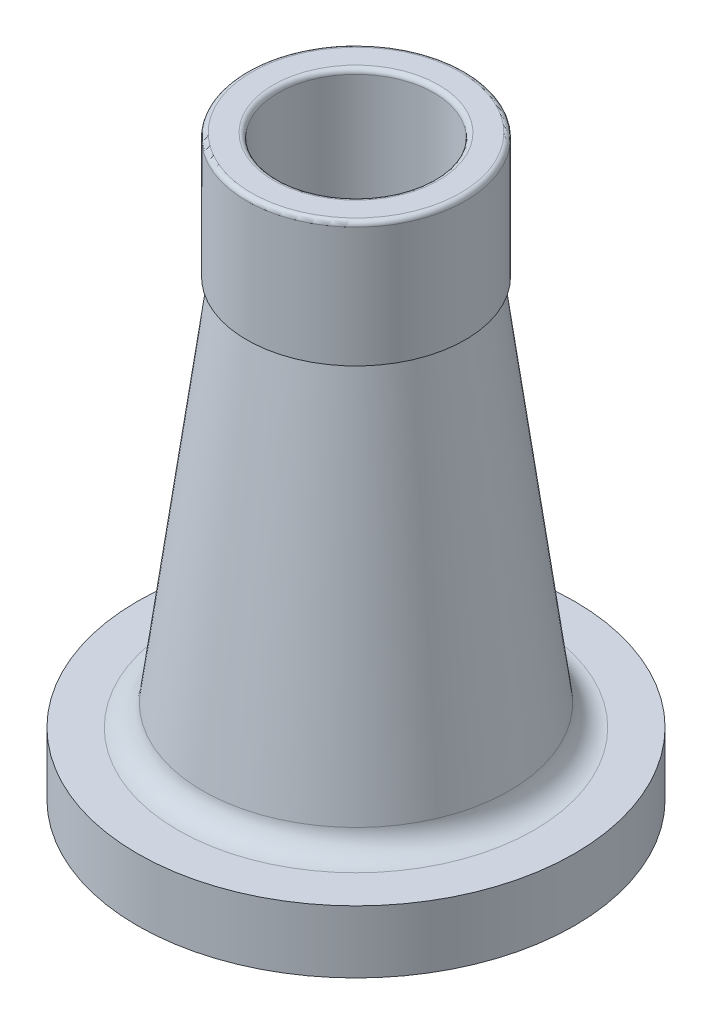
ISO-10303-21;
HEADER;
FILE_DESCRIPTION(('STEP AP214'),'2;1');
FILE_NAME('part.step','',(''),(''),'','','');
FILE_SCHEMA(('AUTOMOTIVE_DESIGN { 1 0 10303 214 1 1 1 1 }'));
ENDSEC;
DATA;
#1=APPLICATION_CONTEXT('core data for automotive mechanical design processes');
#2=APPLICATION_PROTOCOL_DEFINITION('international standard','automotive_design',2000,#1);
#3=PRODUCT_CONTEXT('',#1,'mechanical');
#4=PRODUCT('Part','Part','',(#3));
#5=PRODUCT_RELATED_PRODUCT_CATEGORY('part','',(#4));
#6=PRODUCT_DEFINITION_FORMATION('','',#4);
#7=PRODUCT_DEFINITION_CONTEXT('part definition',#1,'design');
#8=PRODUCT_DEFINITION('design','',#6,#7);
#9=PRODUCT_DEFINITION_SHAPE('','',#8);
#10=(LENGTH_UNIT() NAMED_UNIT(*) SI_UNIT(.MILLI.,.METRE.));
#11=(NAMED_UNIT(*) PLANE_ANGLE_UNIT() SI_UNIT($,.RADIAN.));
#12=(NAMED_UNIT(*) SI_UNIT($,.STERADIAN.) SOLID_ANGLE_UNIT());
#13=UNCERTAINTY_MEASURE_WITH_UNIT(LENGTH_MEASURE(1.E-05),#10,'distance_accuracy_value','');
#14=(GEOMETRIC_REPRESENTATION_CONTEXT(3) GLOBAL_UNCERTAINTY_ASSIGNED_CONTEXT((#13)) GLOBAL_UNIT_ASSIGNED_CONTEXT((#10,
#11,#12)) REPRESENTATION_CONTEXT('',''));
#15=CARTESIAN_POINT('',(0.,0.,0.));
#16=DIRECTION('',(0.,0.,1.));
#17=DIRECTION('',(1.,0.,0.));
#18=AXIS2_PLACEMENT_3D('',#15,#16,#17);
#19=CARTESIAN_POINT('',(50.,0.,0.));
#20=DIRECTION('',(0.,-1.,0.));
#21=DIRECTION('',(0.,0.,-1.));
#22=AXIS2_PLACEMENT_3D('',#19,#20,#21);
#23=PLANE('',#22);
#24=CARTESIAN_POINT('',(0.,0.,0.));
#25=DIRECTION('',(0.,-1.,0.));
#26=DIRECTION('',(0.,0.,-1.));
#27=AXIS2_PLACEMENT_3D('',#24,#25,#26);
#28=CIRCLE('',#27,70.);
#29=CARTESIAN_POINT('',(0.,0.,-70.));
#30=VERTEX_POINT('',#29);
#31=EDGE_CURVE('E102',#30,#30,#28,.T.);
#32=ORIENTED_EDGE('',*,*,#31,.T.);
#33=EDGE_LOOP('',(#32));
#34=FACE_BOUND('',#33,.T.);
#35=CARTESIAN_POINT('',(0.,0.,0.));
#36=DIRECTION('',(0.,-1.,0.));
#37=DIRECTION('',(0.,0.,-1.));
#38=AXIS2_PLACEMENT_3D('',#35,#36,#37);
#39=CIRCLE('',#38,50.);
#40=CARTESIAN_POINT('',(0.,0.,-50.));
#41=VERTEX_POINT('',#40);
#42=EDGE_CURVE('E10',#41,#41,#39,.T.);
#43=ORIENTED_EDGE('',*,*,#42,.F.);
#44=EDGE_LOOP('',(#43));
#45=FACE_BOUND('',#44,.T.);
#46=ADVANCED_FACE('F43',(#34,#45),#23,.T.);
#47=CARTESIAN_POINT('',(0.,0.,0.));
#48=DIRECTION('',(0.,-1.,0.));
#49=DIRECTION('',(0.,0.,-1.));
#50=AXIS2_PLACEMENT_3D('',#47,#48,#49);
#51=TOROIDAL_SURFACE('',#50,47.,3.);
#52=ORIENTED_EDGE('',*,*,#42,.T.);
#53=EDGE_LOOP('',(#52));
#54=FACE_BOUND('',#53,.T.);
#55=CARTESIAN_POINT('',(0.,3.,0.));
#56=DIRECTION('',(0.,-1.,0.));
#57=DIRECTION('',(0.,0.,-1.));
#58=AXIS2_PLACEMENT_3D('',#55,#56,#57);
#59=CIRCLE('',#58,47.);
#60=CARTESIAN_POINT('',(0.,3.,-47.));
#61=VERTEX_POINT('',#60);
#62=EDGE_CURVE('E50',#61,#61,#59,.T.);
#63=ORIENTED_EDGE('',*,*,#62,.F.);
#64=EDGE_LOOP('',(#63));
#65=FACE_BOUND('',#64,.T.);
#66=ADVANCED_FACE('F121',(#54,#65),#51,.F.);
#67=CARTESIAN_POINT('',(42.1572562241326,3.,0.));
#68=DIRECTION('',(0.,-1.,0.));
#69=DIRECTION('',(0.,0.,-1.));
#70=AXIS2_PLACEMENT_3D('',#67,#68,#69);
#71=PLANE('',#70);
#72=ORIENTED_EDGE('',*,*,#62,.T.);
#73=EDGE_LOOP('',(#72));
#74=FACE_BOUND('',#73,.T.);
#75=CARTESIAN_POINT('',(0.,3.,0.));
#76=DIRECTION('',(0.,-1.,0.));
#77=DIRECTION('',(0.,0.,-1.));
#78=AXIS2_PLACEMENT_3D('',#75,#76,#77);
#79=CIRCLE('',#78,42.1572562241326);
#80=CARTESIAN_POINT('',(0.,3.,-42.1572562241326));
#81=VERTEX_POINT('',#80);
#82=EDGE_CURVE('E55',#81,#81,#79,.T.);
#83=ORIENTED_EDGE('',*,*,#82,.F.);
#84=EDGE_LOOP('',(#83));
#85=FACE_BOUND('',#84,.T.);
#86=ADVANCED_FACE('F125',(#74,#85),#71,.T.);
#87=CARTESIAN_POINT('',(0.,132.979213819186,0.));
#88=DIRECTION('',(0.,-1.,0.));
#89=DIRECTION('',(0.,0.,-1.));
#90=AXIS2_PLACEMENT_3D('',#87,#88,#89);
#91=CONICAL_SURFACE('',#90,25.,0.131241260509817);
#92=ORIENTED_EDGE('',*,*,#82,.T.);
#93=EDGE_LOOP('',(#92));
#94=FACE_BOUND('',#93,.T.);
#95=CARTESIAN_POINT('',(0.,132.979213819186,0.));
#96=DIRECTION('',(0.,-1.,0.));
#97=DIRECTION('',(0.,0.,-1.));
#98=AXIS2_PLACEMENT_3D('',#95,#96,#97);
#99=CIRCLE('',#98,25.);
#100=CARTESIAN_POINT('',(0.,132.979213819186,-25.));
#101=VERTEX_POINT('',#100);
#102=EDGE_CURVE('E60',#101,#101,#99,.T.);
#103=ORIENTED_EDGE('',*,*,#102,.F.);
#104=EDGE_LOOP('',(#103));
#105=FACE_BOUND('',#104,.T.);
#106=ADVANCED_FACE('F129',(#94,#105),#91,.F.);
#107=CARTESIAN_POINT('',(0.,0.,0.));
#108=DIRECTION('',(0.,-1.,0.));
#109=DIRECTION('',(0.,0.,-1.));
#110=AXIS2_PLACEMENT_3D('',#107,#108,#109);
#111=CYLINDRICAL_SURFACE('',#110,25.);
#112=ORIENTED_EDGE('',*,*,#102,.T.);
#113=EDGE_LOOP('',(#112));
#114=FACE_BOUND('',#113,.T.);
#115=CARTESIAN_POINT('',(0.,183.5,0.));
#116=DIRECTION('',(0.,-1.,0.));
#117=DIRECTION('',(0.,0.,-1.));
#118=AXIS2_PLACEMENT_3D('',#115,#116,#117);
#119=CIRCLE('',#118,25.);
#120=CARTESIAN_POINT('',(0.,183.5,-25.));
#121=VERTEX_POINT('',#120);
#122=EDGE_CURVE('E66',#121,#121,#119,.T.);
#123=ORIENTED_EDGE('',*,*,#122,.F.);
#124=EDGE_LOOP('',(#123));
#125=FACE_BOUND('',#124,.T.);
#126=ADVANCED_FACE('F135',(#114,#125),#111,.F.);
#127=CARTESIAN_POINT('',(0.,183.5,0.));
#128=DIRECTION('',(0.,-1.,0.));
#129=DIRECTION('',(0.,0.,-1.));
#130=AXIS2_PLACEMENT_3D('',#127,#128,#129);
#131=TOROIDAL_SURFACE('',#130,26.5,1.5);
#132=ORIENTED_EDGE('',*,*,#122,.T.);
#133=EDGE_LOOP('',(#132));
#134=FACE_BOUND('',#133,.T.);
#135=CARTESIAN_POINT('',(0.,185.,0.));
#136=DIRECTION('',(0.,-1.,0.));
#137=DIRECTION('',(0.,0.,-1.));
#138=AXIS2_PLACEMENT_3D('',#135,#136,#137);
#139=CIRCLE('',#138,26.5);
#140=CARTESIAN_POINT('',(0.,185.,-26.5));
#141=VERTEX_POINT('',#140);
#142=EDGE_CURVE('E70',#141,#141,#139,.T.);
#143=ORIENTED_EDGE('',*,*,#142,.F.);
#144=EDGE_LOOP('',(#143));
#145=FACE_BOUND('',#144,.T.);
#146=ADVANCED_FACE('F139',(#134,#145),#131,.T.);
#147=CARTESIAN_POINT('',(33.5,185.,0.));
#148=DIRECTION('',(0.,1.,0.));
#149=DIRECTION('',(0.,0.,1.));
#150=AXIS2_PLACEMENT_3D('',#147,#148,#149);
#151=PLANE('',#150);
#152=ORIENTED_EDGE('',*,*,#142,.T.);
#153=EDGE_LOOP('',(#152));
#154=FACE_BOUND('',#153,.T.);
#155=CARTESIAN_POINT('',(0.,185.,0.));
#156=DIRECTION('',(0.,-1.,0.));
#157=DIRECTION('',(0.,0.,-1.));
#158=AXIS2_PLACEMENT_3D('',#155,#156,#157);
#159=CIRCLE('',#158,33.5);
#160=CARTESIAN_POINT('',(0.,185.,-33.5));
#161=VERTEX_POINT('',#160);
#162=EDGE_CURVE('E74',#161,#161,#159,.T.);
#163=ORIENTED_EDGE('',*,*,#162,.F.);
#164=EDGE_LOOP('',(#163));
#165=FACE_BOUND('',#164,.T.);
#166=ADVANCED_FACE('F143',(#154,#165),#151,.T.);
#167=CARTESIAN_POINT('',(0.,183.5,0.));
#168=DIRECTION('',(0.,-1.,0.));
#169=DIRECTION('',(0.,0.,-1.));
#170=AXIS2_PLACEMENT_3D('',#167,#168,#169);
#171=TOROIDAL_SURFACE('',#170,33.5,1.5);
#172=ORIENTED_EDGE('',*,*,#162,.T.);
#173=EDGE_LOOP('',(#172));
#174=FACE_BOUND('',#173,.T.);
#175=CARTESIAN_POINT('',(0.,183.5,0.));
#176=DIRECTION('',(0.,-1.,0.));
#177=DIRECTION('',(0.,0.,-1.));
#178=AXIS2_PLACEMENT_3D('',#175,#176,#177);
#179=CIRCLE('',#178,35.);
#180=CARTESIAN_POINT('',(0.,183.5,-35.));
#181=VERTEX_POINT('',#180);
#182=EDGE_CURVE('E78',#181,#181,#179,.T.);
#183=ORIENTED_EDGE('',*,*,#182,.F.);
#184=EDGE_LOOP('',(#183));
#185=FACE_BOUND('',#184,.T.);
#186=ADVANCED_FACE('F147',(#174,#185),#171,.T.);
#187=CARTESIAN_POINT('',(0.,0.,0.));
#188=DIRECTION('',(0.,-1.,0.));
#189=DIRECTION('',(0.,0.,-1.));
#190=AXIS2_PLACEMENT_3D('',#187,#188,#189);
#191=CYLINDRICAL_SURFACE('',#190,35.);
#192=ORIENTED_EDGE('',*,*,#182,.T.);
#193=EDGE_LOOP('',(#192));
#194=FACE_BOUND('',#193,.T.);
#195=CARTESIAN_POINT('',(0.,145.,0.));
#196=DIRECTION('',(0.,-1.,0.));
#197=DIRECTION('',(0.,0.,-1.));
#198=AXIS2_PLACEMENT_3D('',#195,#196,#197);
#199=CIRCLE('',#198,35.);
#200=CARTESIAN_POINT('',(0.,145.,-35.));
#201=VERTEX_POINT('',#200);
#202=EDGE_CURVE('E82',#201,#201,#199,.T.);
#203=ORIENTED_EDGE('',*,*,#202,.F.);
#204=EDGE_LOOP('',(#203));
#205=FACE_BOUND('',#204,.T.);
#206=ADVANCED_FACE('F151',(#194,#205),#191,.T.);
#207=CARTESIAN_POINT('',(33.5,145.,0.));
#208=DIRECTION('',(0.,-1.,0.));
#209=DIRECTION('',(0.,0.,-1.));
#210=AXIS2_PLACEMENT_3D('',#207,#208,#209);
#211=PLANE('',#210);
#212=ORIENTED_EDGE('',*,*,#202,.T.);
#213=EDGE_LOOP('',(#212));
#214=FACE_BOUND('',#213,.T.);
#215=CARTESIAN_POINT('',(0.,145.,0.));
#216=DIRECTION('',(0.,-1.,0.));
#217=DIRECTION('',(0.,0.,-1.));
#218=AXIS2_PLACEMENT_3D('',#215,#216,#217);
#219=CIRCLE('',#218,33.5);
#220=CARTESIAN_POINT('',(0.,145.,-33.5));
#221=VERTEX_POINT('',#220);
#222=EDGE_CURVE('E86',#221,#221,#219,.T.);
#223=ORIENTED_EDGE('',*,*,#222,.F.);
#224=EDGE_LOOP('',(#223));
#225=FACE_BOUND('',#224,.T.);
#226=ADVANCED_FACE('F155',(#214,#225),#211,.T.);
#227=CARTESIAN_POINT('',(0.,26.9530813675208,0.));
#228=DIRECTION('',(0.,-1.,0.));
#229=DIRECTION('',(0.,0.,-1.));
#230=AXIS2_PLACEMENT_3D('',#227,#228,#229);
#231=CONICAL_SURFACE('',#230,49.0821932594873,0.131241260509817);
#232=ORIENTED_EDGE('',*,*,#222,.T.);
#233=EDGE_LOOP('',(#232));
#234=FACE_BOUND('',#233,.T.);
#235=CARTESIAN_POINT('',(0.,26.9530813675208,0.));
#236=DIRECTION('',(0.,-1.,0.));
#237=DIRECTION('',(0.,0.,-1.));
#238=AXIS2_PLACEMENT_3D('',#235,#236,#237);
#239=CIRCLE('',#238,49.0821932594873);
#240=CARTESIAN_POINT('',(0.,26.9530813675208,-49.0821932594873));
#241=VERTEX_POINT('',#240);
#242=EDGE_CURVE('E90',#241,#241,#239,.T.);
#243=ORIENTED_EDGE('',*,*,#242,.F.);
#244=EDGE_LOOP('',(#243));
#245=FACE_BOUND('',#244,.T.);
#246=ADVANCED_FACE('F159',(#234,#245),#231,.T.);
#247=CARTESIAN_POINT('',(0.,28.,0.));
#248=DIRECTION('',(0.,-1.,0.));
#249=DIRECTION('',(0.,0.,-1.));
#250=AXIS2_PLACEMENT_3D('',#247,#248,#249);
#251=TOROIDAL_SURFACE('',#250,57.0133950206939,8.);
#252=ORIENTED_EDGE('',*,*,#242,.T.);
#253=EDGE_LOOP('',(#252));
#254=FACE_BOUND('',#253,.T.);
#255=CARTESIAN_POINT('',(0.,20.,0.));
#256=DIRECTION('',(0.,-1.,0.));
#257=DIRECTION('',(0.,0.,-1.));
#258=AXIS2_PLACEMENT_3D('',#255,#256,#257);
#259=CIRCLE('',#258,57.013395020694);
#260=CARTESIAN_POINT('',(0.,20.,-57.013395020694));
#261=VERTEX_POINT('',#260);
#262=EDGE_CURVE('E94',#261,#261,#259,.T.);
#263=ORIENTED_EDGE('',*,*,#262,.F.);
#264=EDGE_LOOP('',(#263));
#265=FACE_BOUND('',#264,.T.);
#266=ADVANCED_FACE('F117',(#254,#265),#251,.F.);
#267=CARTESIAN_POINT('',(70.,20.,0.));
#268=DIRECTION('',(0.,1.,0.));
#269=DIRECTION('',(0.,0.,1.));
#270=AXIS2_PLACEMENT_3D('',#267,#268,#269);
#271=PLANE('',#270);
#272=ORIENTED_EDGE('',*,*,#262,.T.);
#273=EDGE_LOOP('',(#272));
#274=FACE_BOUND('',#273,.T.);
#275=CARTESIAN_POINT('',(0.,20.,0.));
#276=DIRECTION('',(0.,-1.,0.));
#277=DIRECTION('',(0.,0.,-1.));
#278=AXIS2_PLACEMENT_3D('',#275,#276,#277);
#279=CIRCLE('',#278,70.);
#280=CARTESIAN_POINT('',(0.,20.,-70.));
#281=VERTEX_POINT('',#280);
#282=EDGE_CURVE('E98',#281,#281,#279,.T.);
#283=ORIENTED_EDGE('',*,*,#282,.F.);
#284=EDGE_LOOP('',(#283));
#285=FACE_BOUND('',#284,.T.);
#286=ADVANCED_FACE('F111',(#274,#285),#271,.T.);
#287=CARTESIAN_POINT('',(0.,0.,0.));
#288=DIRECTION('',(0.,-1.,0.));
#289=DIRECTION('',(0.,0.,-1.));
#290=AXIS2_PLACEMENT_3D('',#287,#288,#289);
#291=CYLINDRICAL_SURFACE('',#290,70.);
#292=ORIENTED_EDGE('',*,*,#282,.T.);
#293=EDGE_LOOP('',(#292));
#294=FACE_BOUND('',#293,.T.);
#295=ORIENTED_EDGE('',*,*,#31,.F.);
#296=EDGE_LOOP('',(#295));
#297=FACE_BOUND('',#296,.T.);
#298=ADVANCED_FACE('F109',(#294,#297),#291,.T.);
#299=CLOSED_SHELL('',(#46,#66,#86,#106,#126,#146,#166,#186,#206,#226,#246,#266,#286,#298));
#300=MANIFOLD_SOLID_BREP('B2',#299);
#301=ADVANCED_BREP_SHAPE_REPRESENTATION('',(#18,#300),#14);
#302=SHAPE_DEFINITION_REPRESENTATION(#9,#301);
ENDSEC;
END-ISO-10303-21;
